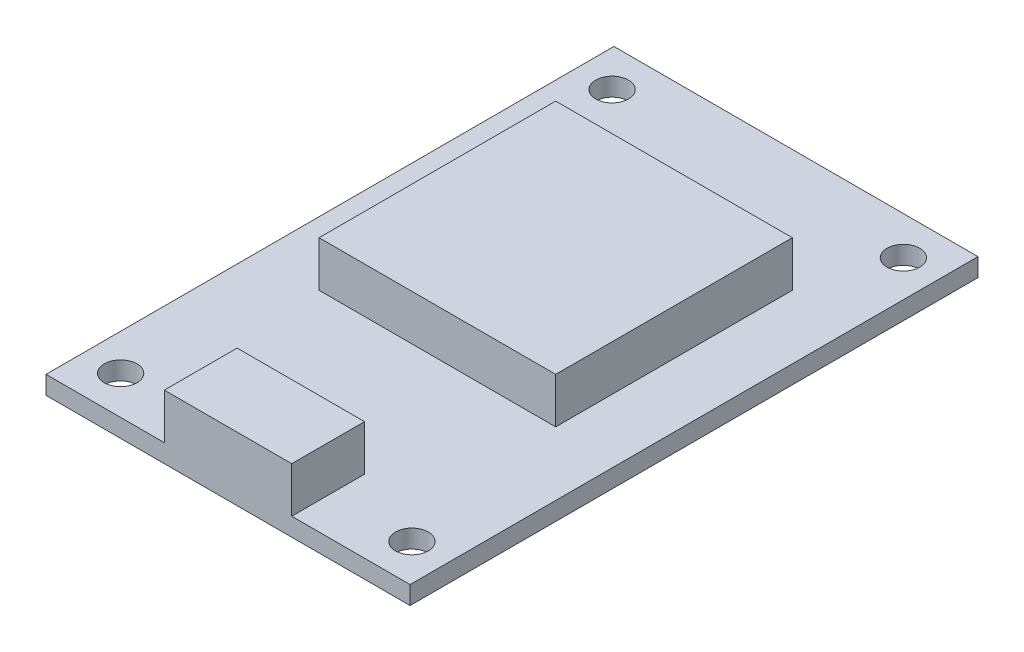
ISO-10303-21;
HEADER;
FILE_DESCRIPTION(('STEP AP214'),'2;1');
FILE_NAME('part.step','',(''),(''),'','','');
FILE_SCHEMA(('AUTOMOTIVE_DESIGN { 1 0 10303 214 1 1 1 1 }'));
ENDSEC;
DATA;
#1=APPLICATION_CONTEXT('core data for automotive mechanical design processes');
#2=APPLICATION_PROTOCOL_DEFINITION('international standard','automotive_design',2000,#1);
#3=PRODUCT_CONTEXT('',#1,'mechanical');
#4=PRODUCT('Part','Part','',(#3));
#5=PRODUCT_RELATED_PRODUCT_CATEGORY('part','',(#4));
#6=PRODUCT_DEFINITION_FORMATION('','',#4);
#7=PRODUCT_DEFINITION_CONTEXT('part definition',#1,'design');
#8=PRODUCT_DEFINITION('design','',#6,#7);
#9=PRODUCT_DEFINITION_SHAPE('','',#8);
#10=(LENGTH_UNIT() NAMED_UNIT(*) SI_UNIT(.MILLI.,.METRE.));
#11=(NAMED_UNIT(*) PLANE_ANGLE_UNIT() SI_UNIT($,.RADIAN.));
#12=(NAMED_UNIT(*) SI_UNIT($,.STERADIAN.) SOLID_ANGLE_UNIT());
#13=UNCERTAINTY_MEASURE_WITH_UNIT(LENGTH_MEASURE(1.E-05),#10,'distance_accuracy_value','');
#14=(GEOMETRIC_REPRESENTATION_CONTEXT(3) GLOBAL_UNCERTAINTY_ASSIGNED_CONTEXT((#13)) GLOBAL_UNIT_ASSIGNED_CONTEXT((#10,
#11,#12)) REPRESENTATION_CONTEXT('',''));
#15=CARTESIAN_POINT('',(0.,0.,0.));
#16=DIRECTION('',(0.,0.,1.));
#17=DIRECTION('',(1.,0.,0.));
#18=AXIS2_PLACEMENT_3D('',#15,#16,#17);
#19=CARTESIAN_POINT('',(0.,1.27,0.));
#20=DIRECTION('',(0.,-1.,0.));
#21=DIRECTION('',(0.,0.,-1.));
#22=AXIS2_PLACEMENT_3D('',#19,#20,#21);
#23=PLANE('',#22);
#24=DIRECTION('',(0.,0.,-1.));
#25=VECTOR('',#24,1.);
#26=CARTESIAN_POINT('',(8.255,1.27,5.207));
#27=LINE('',#26,#25);
#28=CARTESIAN_POINT('',(8.255,1.27,5.207));
#29=VERTEX_POINT('',#28);
#30=CARTESIAN_POINT('',(8.255,1.27,-11.303));
#31=VERTEX_POINT('',#30);
#32=EDGE_CURVE('E153',#29,#31,#27,.T.);
#33=ORIENTED_EDGE('',*,*,#32,.F.);
#34=DIRECTION('',(1.,0.,0.));
#35=VECTOR('',#34,1.);
#36=CARTESIAN_POINT('',(-8.255,1.27,5.207));
#37=LINE('',#36,#35);
#38=CARTESIAN_POINT('',(-8.255,1.27,5.207));
#39=VERTEX_POINT('',#38);
#40=EDGE_CURVE('E169',#39,#29,#37,.T.);
#41=ORIENTED_EDGE('',*,*,#40,.F.);
#42=DIRECTION('',(0.,0.,1.));
#43=VECTOR('',#42,1.);
#44=CARTESIAN_POINT('',(-8.255,1.27,5.207));
#45=LINE('',#44,#43);
#46=CARTESIAN_POINT('',(-8.255,1.27,-11.303));
#47=VERTEX_POINT('',#46);
#48=EDGE_CURVE('E182',#47,#39,#45,.T.);
#49=ORIENTED_EDGE('',*,*,#48,.F.);
#50=DIRECTION('',(-1.,0.,0.));
#51=VECTOR('',#50,1.);
#52=CARTESIAN_POINT('',(-8.255,1.27,-11.303));
#53=LINE('',#52,#51);
#54=EDGE_CURVE('E158',#31,#47,#53,.T.);
#55=ORIENTED_EDGE('',*,*,#54,.F.);
#56=EDGE_LOOP('',(#33,#41,#49,#55));
#57=FACE_BOUND('',#56,.T.);
#58=CARTESIAN_POINT('',(10.16,1.27,-17.145));
#59=DIRECTION('',(0.,1.,0.));
#60=DIRECTION('',(0.,0.,1.));
#61=AXIS2_PLACEMENT_3D('',#58,#59,#60);
#62=CIRCLE('',#61,1.143);
#63=CARTESIAN_POINT('',(10.16,1.27,-16.002));
#64=VERTEX_POINT('',#63);
#65=EDGE_CURVE('E229',#64,#64,#62,.T.);
#66=ORIENTED_EDGE('',*,*,#65,.F.);
#67=EDGE_LOOP('',(#66));
#68=FACE_BOUND('',#67,.T.);
#69=CARTESIAN_POINT('',(-10.16,1.27,-17.145));
#70=DIRECTION('',(0.,1.,0.));
#71=DIRECTION('',(0.,0.,1.));
#72=AXIS2_PLACEMENT_3D('',#69,#70,#71);
#73=CIRCLE('',#72,1.143);
#74=CARTESIAN_POINT('',(-10.16,1.27,-16.002));
#75=VERTEX_POINT('',#74);
#76=EDGE_CURVE('E221',#75,#75,#73,.T.);
#77=ORIENTED_EDGE('',*,*,#76,.F.);
#78=EDGE_LOOP('',(#77));
#79=FACE_BOUND('',#78,.T.);
#80=CARTESIAN_POINT('',(10.16,1.27,17.145));
#81=DIRECTION('',(0.,1.,0.));
#82=DIRECTION('',(0.,0.,1.));
#83=AXIS2_PLACEMENT_3D('',#80,#81,#82);
#84=CIRCLE('',#83,1.143);
#85=CARTESIAN_POINT('',(10.16,1.27,18.288));
#86=VERTEX_POINT('',#85);
#87=EDGE_CURVE('E213',#86,#86,#84,.T.);
#88=ORIENTED_EDGE('',*,*,#87,.F.);
#89=EDGE_LOOP('',(#88));
#90=FACE_BOUND('',#89,.T.);
#91=CARTESIAN_POINT('',(-10.16,1.27,17.145));
#92=DIRECTION('',(0.,1.,0.));
#93=DIRECTION('',(0.,0.,1.));
#94=AXIS2_PLACEMENT_3D('',#91,#92,#93);
#95=CIRCLE('',#94,1.143);
#96=CARTESIAN_POINT('',(-10.16,1.27,18.288));
#97=VERTEX_POINT('',#96);
#98=EDGE_CURVE('E205',#97,#97,#95,.T.);
#99=ORIENTED_EDGE('',*,*,#98,.F.);
#100=EDGE_LOOP('',(#99));
#101=FACE_BOUND('',#100,.T.);
#102=DIRECTION('',(0.,0.,-1.));
#103=VECTOR('',#102,1.);
#104=CARTESIAN_POINT('',(4.445,1.27,14.732));
#105=LINE('',#104,#103);
#106=CARTESIAN_POINT('',(4.445,1.27,19.812));
#107=VERTEX_POINT('',#106);
#108=CARTESIAN_POINT('',(4.445,1.27,14.732));
#109=VERTEX_POINT('',#108);
#110=EDGE_CURVE('E151',#107,#109,#105,.T.);
#111=ORIENTED_EDGE('',*,*,#110,.F.);
#112=DIRECTION('',(1.,0.,0.));
#113=VECTOR('',#112,1.);
#114=CARTESIAN_POINT('',(-12.7,1.27,19.812));
#115=LINE('',#114,#113);
#116=CARTESIAN_POINT('',(12.7,1.27,19.812));
#117=VERTEX_POINT('',#116);
#118=EDGE_CURVE('E248',#107,#117,#115,.T.);
#119=ORIENTED_EDGE('',*,*,#118,.T.);
#120=DIRECTION('',(0.,0.,-1.));
#121=VECTOR('',#120,1.);
#122=CARTESIAN_POINT('',(12.7,1.27,19.812));
#123=LINE('',#122,#121);
#124=CARTESIAN_POINT('',(12.7,1.27,-19.812));
#125=VERTEX_POINT('',#124);
#126=EDGE_CURVE('E237',#117,#125,#123,.T.);
#127=ORIENTED_EDGE('',*,*,#126,.T.);
#128=DIRECTION('',(-1.,0.,0.));
#129=VECTOR('',#128,1.);
#130=CARTESIAN_POINT('',(-12.7,1.27,-19.812));
#131=LINE('',#130,#129);
#132=CARTESIAN_POINT('',(-12.7,1.27,-19.812));
#133=VERTEX_POINT('',#132);
#134=EDGE_CURVE('E241',#125,#133,#131,.T.);
#135=ORIENTED_EDGE('',*,*,#134,.T.);
#136=DIRECTION('',(0.,0.,1.));
#137=VECTOR('',#136,1.);
#138=CARTESIAN_POINT('',(-12.7,1.27,19.812));
#139=LINE('',#138,#137);
#140=CARTESIAN_POINT('',(-12.7,1.27,19.812));
#141=VERTEX_POINT('',#140);
#142=EDGE_CURVE('E245',#133,#141,#139,.T.);
#143=ORIENTED_EDGE('',*,*,#142,.T.);
#144=CARTESIAN_POINT('',(-4.445,1.27,19.812));
#145=VERTEX_POINT('',#144);
#146=EDGE_CURVE('E249',#141,#145,#115,.T.);
#147=ORIENTED_EDGE('',*,*,#146,.T.);
#148=DIRECTION('',(0.,0.,1.));
#149=VECTOR('',#148,1.);
#150=CARTESIAN_POINT('',(-4.445,1.27,14.732));
#151=LINE('',#150,#149);
#152=CARTESIAN_POINT('',(-4.445,1.27,14.732));
#153=VERTEX_POINT('',#152);
#154=EDGE_CURVE('E60',#153,#145,#151,.T.);
#155=ORIENTED_EDGE('',*,*,#154,.F.);
#156=DIRECTION('',(-1.,0.,0.));
#157=VECTOR('',#156,1.);
#158=CARTESIAN_POINT('',(-4.445,1.27,14.732));
#159=LINE('',#158,#157);
#160=EDGE_CURVE('E55',#109,#153,#159,.T.);
#161=ORIENTED_EDGE('',*,*,#160,.F.);
#162=EDGE_LOOP('',(#111,#119,#127,#135,#143,#147,#155,#161));
#163=FACE_BOUND('',#162,.T.);
#164=ADVANCED_FACE('F39',(#57,#68,#79,#90,#101,#163),#23,.F.);
#165=CARTESIAN_POINT('',(0.,0.,0.));
#166=DIRECTION('',(0.,-1.,0.));
#167=DIRECTION('',(0.,0.,-1.));
#168=AXIS2_PLACEMENT_3D('',#165,#166,#167);
#169=PLANE('',#168);
#170=CARTESIAN_POINT('',(10.16,0.,17.145));
#171=DIRECTION('',(0.,1.,0.));
#172=DIRECTION('',(0.,0.,1.));
#173=AXIS2_PLACEMENT_3D('',#170,#171,#172);
#174=CIRCLE('',#173,1.143);
#175=CARTESIAN_POINT('',(10.16,0.,18.288));
#176=VERTEX_POINT('',#175);
#177=EDGE_CURVE('E209',#176,#176,#174,.T.);
#178=ORIENTED_EDGE('',*,*,#177,.T.);
#179=EDGE_LOOP('',(#178));
#180=FACE_BOUND('',#179,.T.);
#181=CARTESIAN_POINT('',(10.16,0.,-17.145));
#182=DIRECTION('',(0.,1.,0.));
#183=DIRECTION('',(0.,0.,1.));
#184=AXIS2_PLACEMENT_3D('',#181,#182,#183);
#185=CIRCLE('',#184,1.143);
#186=CARTESIAN_POINT('',(10.16,0.,-16.002));
#187=VERTEX_POINT('',#186);
#188=EDGE_CURVE('E225',#187,#187,#185,.T.);
#189=ORIENTED_EDGE('',*,*,#188,.T.);
#190=EDGE_LOOP('',(#189));
#191=FACE_BOUND('',#190,.T.);
#192=DIRECTION('',(0.,0.,-1.));
#193=VECTOR('',#192,1.);
#194=CARTESIAN_POINT('',(12.7,0.,19.812));
#195=LINE('',#194,#193);
#196=CARTESIAN_POINT('',(12.7,0.,19.812));
#197=VERTEX_POINT('',#196);
#198=CARTESIAN_POINT('',(12.7,0.,-19.812));
#199=VERTEX_POINT('',#198);
#200=EDGE_CURVE('E233',#197,#199,#195,.T.);
#201=ORIENTED_EDGE('',*,*,#200,.F.);
#202=DIRECTION('',(1.,0.,0.));
#203=VECTOR('',#202,1.);
#204=CARTESIAN_POINT('',(-12.7,0.,19.812));
#205=LINE('',#204,#203);
#206=CARTESIAN_POINT('',(-12.7,0.,19.812));
#207=VERTEX_POINT('',#206);
#208=EDGE_CURVE('E242',#207,#197,#205,.T.);
#209=ORIENTED_EDGE('',*,*,#208,.F.);
#210=DIRECTION('',(0.,0.,1.));
#211=VECTOR('',#210,1.);
#212=CARTESIAN_POINT('',(-12.7,0.,19.812));
#213=LINE('',#212,#211);
#214=CARTESIAN_POINT('',(-12.7,0.,-19.812));
#215=VERTEX_POINT('',#214);
#216=EDGE_CURVE('E259',#215,#207,#213,.T.);
#217=ORIENTED_EDGE('',*,*,#216,.F.);
#218=DIRECTION('',(-1.,0.,0.));
#219=VECTOR('',#218,1.);
#220=CARTESIAN_POINT('',(-12.7,0.,-19.812));
#221=LINE('',#220,#219);
#222=EDGE_CURVE('E256',#199,#215,#221,.T.);
#223=ORIENTED_EDGE('',*,*,#222,.F.);
#224=EDGE_LOOP('',(#201,#209,#217,#223));
#225=FACE_BOUND('',#224,.T.);
#226=CARTESIAN_POINT('',(-10.16,0.,-17.145));
#227=DIRECTION('',(0.,1.,0.));
#228=DIRECTION('',(0.,0.,1.));
#229=AXIS2_PLACEMENT_3D('',#226,#227,#228);
#230=CIRCLE('',#229,1.143);
#231=CARTESIAN_POINT('',(-10.16,0.,-16.002));
#232=VERTEX_POINT('',#231);
#233=EDGE_CURVE('E217',#232,#232,#230,.T.);
#234=ORIENTED_EDGE('',*,*,#233,.T.);
#235=EDGE_LOOP('',(#234));
#236=FACE_BOUND('',#235,.T.);
#237=CARTESIAN_POINT('',(-10.16,0.,17.145));
#238=DIRECTION('',(0.,1.,0.));
#239=DIRECTION('',(0.,0.,1.));
#240=AXIS2_PLACEMENT_3D('',#237,#238,#239);
#241=CIRCLE('',#240,1.143);
#242=CARTESIAN_POINT('',(-10.16,0.,18.288));
#243=VERTEX_POINT('',#242);
#244=EDGE_CURVE('E204',#243,#243,#241,.T.);
#245=ORIENTED_EDGE('',*,*,#244,.T.);
#246=EDGE_LOOP('',(#245));
#247=FACE_BOUND('',#246,.T.);
#248=ADVANCED_FACE('F282',(#180,#191,#225,#236,#247),#169,.T.);
#249=CARTESIAN_POINT('',(12.7,1.27,19.812));
#250=DIRECTION('',(-1.,0.,0.));
#251=DIRECTION('',(0.,0.,1.));
#252=AXIS2_PLACEMENT_3D('',#249,#250,#251);
#253=PLANE('',#252);
#254=ORIENTED_EDGE('',*,*,#200,.T.);
#255=DIRECTION('',(0.,-1.,0.));
#256=VECTOR('',#255,1.);
#257=CARTESIAN_POINT('',(12.7,1.27,-19.812));
#258=LINE('',#257,#256);
#259=EDGE_CURVE('E11',#125,#199,#258,.T.);
#260=ORIENTED_EDGE('',*,*,#259,.F.);
#261=ORIENTED_EDGE('',*,*,#126,.F.);
#262=DIRECTION('',(0.,-1.,0.));
#263=VECTOR('',#262,1.);
#264=CARTESIAN_POINT('',(12.7,1.27,19.812));
#265=LINE('',#264,#263);
#266=EDGE_CURVE('E252',#117,#197,#265,.T.);
#267=ORIENTED_EDGE('',*,*,#266,.T.);
#268=EDGE_LOOP('',(#254,#260,#261,#267));
#269=FACE_BOUND('',#268,.T.);
#270=ADVANCED_FACE('F41',(#269),#253,.F.);
#271=CARTESIAN_POINT('',(-12.7,1.27,-19.812));
#272=DIRECTION('',(0.,0.,1.));
#273=DIRECTION('',(1.,0.,0.));
#274=AXIS2_PLACEMENT_3D('',#271,#272,#273);
#275=PLANE('',#274);
#276=ORIENTED_EDGE('',*,*,#222,.T.);
#277=DIRECTION('',(0.,-1.,0.));
#278=VECTOR('',#277,1.);
#279=CARTESIAN_POINT('',(-12.7,1.27,-19.812));
#280=LINE('',#279,#278);
#281=EDGE_CURVE('E48',#133,#215,#280,.T.);
#282=ORIENTED_EDGE('',*,*,#281,.F.);
#283=ORIENTED_EDGE('',*,*,#134,.F.);
#284=ORIENTED_EDGE('',*,*,#259,.T.);
#285=EDGE_LOOP('',(#276,#282,#283,#284));
#286=FACE_BOUND('',#285,.T.);
#287=ADVANCED_FACE('F334',(#286),#275,.F.);
#288=CARTESIAN_POINT('',(-12.7,1.27,19.812));
#289=DIRECTION('',(1.,0.,0.));
#290=DIRECTION('',(0.,0.,-1.));
#291=AXIS2_PLACEMENT_3D('',#288,#289,#290);
#292=PLANE('',#291);
#293=ORIENTED_EDGE('',*,*,#216,.T.);
#294=DIRECTION('',(0.,-1.,0.));
#295=VECTOR('',#294,1.);
#296=CARTESIAN_POINT('',(-12.7,1.27,19.812));
#297=LINE('',#296,#295);
#298=EDGE_CURVE('E267',#141,#207,#297,.T.);
#299=ORIENTED_EDGE('',*,*,#298,.F.);
#300=ORIENTED_EDGE('',*,*,#142,.F.);
#301=ORIENTED_EDGE('',*,*,#281,.T.);
#302=EDGE_LOOP('',(#293,#299,#300,#301));
#303=FACE_BOUND('',#302,.T.);
#304=ADVANCED_FACE('F276',(#303),#292,.F.);
#305=CARTESIAN_POINT('',(-12.7,1.27,19.812));
#306=DIRECTION('',(0.,0.,-1.));
#307=DIRECTION('',(-1.,0.,0.));
#308=AXIS2_PLACEMENT_3D('',#305,#306,#307);
#309=PLANE('',#308);
#310=ORIENTED_EDGE('',*,*,#208,.T.);
#311=ORIENTED_EDGE('',*,*,#266,.F.);
#312=ORIENTED_EDGE('',*,*,#118,.F.);
#313=DIRECTION('',(0.,-1.,0.));
#314=VECTOR('',#313,1.);
#315=CARTESIAN_POINT('',(4.445,4.445,19.812));
#316=LINE('',#315,#314);
#317=CARTESIAN_POINT('',(4.445,4.445,19.812));
#318=VERTEX_POINT('',#317);
#319=EDGE_CURVE('E292',#318,#107,#316,.T.);
#320=ORIENTED_EDGE('',*,*,#319,.F.);
#321=DIRECTION('',(1.,0.,0.));
#322=VECTOR('',#321,1.);
#323=CARTESIAN_POINT('',(-4.445,4.445,19.812));
#324=LINE('',#323,#322);
#325=CARTESIAN_POINT('',(-4.445,4.445,19.812));
#326=VERTEX_POINT('',#325);
#327=EDGE_CURVE('E144',#326,#318,#324,.T.);
#328=ORIENTED_EDGE('',*,*,#327,.F.);
#329=DIRECTION('',(0.,-1.,0.));
#330=VECTOR('',#329,1.);
#331=CARTESIAN_POINT('',(-4.445,4.445,19.812));
#332=LINE('',#331,#330);
#333=EDGE_CURVE('E160',#326,#145,#332,.T.);
#334=ORIENTED_EDGE('',*,*,#333,.T.);
#335=ORIENTED_EDGE('',*,*,#146,.F.);
#336=ORIENTED_EDGE('',*,*,#298,.T.);
#337=EDGE_LOOP('',(#310,#311,#312,#320,#328,#334,#335,#336));
#338=FACE_BOUND('',#337,.T.);
#339=ADVANCED_FACE('F286',(#338),#309,.F.);
#340=CARTESIAN_POINT('',(10.16,1.27,-17.145));
#341=DIRECTION('',(0.,-1.,0.));
#342=DIRECTION('',(0.,0.,-1.));
#343=AXIS2_PLACEMENT_3D('',#340,#341,#342);
#344=CYLINDRICAL_SURFACE('',#343,1.143);
#345=ORIENTED_EDGE('',*,*,#65,.T.);
#346=EDGE_LOOP('',(#345));
#347=FACE_BOUND('',#346,.T.);
#348=ORIENTED_EDGE('',*,*,#188,.F.);
#349=EDGE_LOOP('',(#348));
#350=FACE_BOUND('',#349,.T.);
#351=ADVANCED_FACE('F328',(#347,#350),#344,.F.);
#352=CARTESIAN_POINT('',(-10.16,1.27,-17.145));
#353=DIRECTION('',(0.,-1.,0.));
#354=DIRECTION('',(0.,0.,-1.));
#355=AXIS2_PLACEMENT_3D('',#352,#353,#354);
#356=CYLINDRICAL_SURFACE('',#355,1.143);
#357=ORIENTED_EDGE('',*,*,#76,.T.);
#358=EDGE_LOOP('',(#357));
#359=FACE_BOUND('',#358,.T.);
#360=ORIENTED_EDGE('',*,*,#233,.F.);
#361=EDGE_LOOP('',(#360));
#362=FACE_BOUND('',#361,.T.);
#363=ADVANCED_FACE('F375',(#359,#362),#356,.F.);
#364=CARTESIAN_POINT('',(10.16,1.27,17.145));
#365=DIRECTION('',(0.,-1.,0.));
#366=DIRECTION('',(0.,0.,-1.));
#367=AXIS2_PLACEMENT_3D('',#364,#365,#366);
#368=CYLINDRICAL_SURFACE('',#367,1.143);
#369=ORIENTED_EDGE('',*,*,#87,.T.);
#370=EDGE_LOOP('',(#369));
#371=FACE_BOUND('',#370,.T.);
#372=ORIENTED_EDGE('',*,*,#177,.F.);
#373=EDGE_LOOP('',(#372));
#374=FACE_BOUND('',#373,.T.);
#375=ADVANCED_FACE('F383',(#371,#374),#368,.F.);
#376=CARTESIAN_POINT('',(-10.16,1.27,17.145));
#377=DIRECTION('',(0.,-1.,0.));
#378=DIRECTION('',(0.,0.,-1.));
#379=AXIS2_PLACEMENT_3D('',#376,#377,#378);
#380=CYLINDRICAL_SURFACE('',#379,1.143);
#381=ORIENTED_EDGE('',*,*,#98,.T.);
#382=EDGE_LOOP('',(#381));
#383=FACE_BOUND('',#382,.T.);
#384=ORIENTED_EDGE('',*,*,#244,.F.);
#385=EDGE_LOOP('',(#384));
#386=FACE_BOUND('',#385,.T.);
#387=ADVANCED_FACE('F391',(#383,#386),#380,.F.);
#388=CARTESIAN_POINT('',(8.255,4.445,5.207));
#389=DIRECTION('',(-1.,0.,0.));
#390=DIRECTION('',(0.,0.,1.));
#391=AXIS2_PLACEMENT_3D('',#388,#389,#390);
#392=PLANE('',#391);
#393=ORIENTED_EDGE('',*,*,#32,.T.);
#394=DIRECTION('',(0.,-1.,0.));
#395=VECTOR('',#394,1.);
#396=CARTESIAN_POINT('',(8.255,4.445,-11.303));
#397=LINE('',#396,#395);
#398=CARTESIAN_POINT('',(8.255,4.445,-11.303));
#399=VERTEX_POINT('',#398);
#400=EDGE_CURVE('E200',#399,#31,#397,.T.);
#401=ORIENTED_EDGE('',*,*,#400,.F.);
#402=DIRECTION('',(0.,0.,-1.));
#403=VECTOR('',#402,1.);
#404=CARTESIAN_POINT('',(8.255,4.445,5.207));
#405=LINE('',#404,#403);
#406=CARTESIAN_POINT('',(8.255,4.445,5.207));
#407=VERTEX_POINT('',#406);
#408=EDGE_CURVE('E164',#407,#399,#405,.T.);
#409=ORIENTED_EDGE('',*,*,#408,.F.);
#410=DIRECTION('',(0.,-1.,0.));
#411=VECTOR('',#410,1.);
#412=CARTESIAN_POINT('',(8.255,4.445,5.207));
#413=LINE('',#412,#411);
#414=EDGE_CURVE('E177',#407,#29,#413,.T.);
#415=ORIENTED_EDGE('',*,*,#414,.T.);
#416=EDGE_LOOP('',(#393,#401,#409,#415));
#417=FACE_BOUND('',#416,.T.);
#418=ADVANCED_FACE('F400',(#417),#392,.F.);
#419=CARTESIAN_POINT('',(-8.255,4.445,-11.303));
#420=DIRECTION('',(0.,0.,1.));
#421=DIRECTION('',(1.,0.,0.));
#422=AXIS2_PLACEMENT_3D('',#419,#420,#421);
#423=PLANE('',#422);
#424=ORIENTED_EDGE('',*,*,#54,.T.);
#425=DIRECTION('',(0.,-1.,0.));
#426=VECTOR('',#425,1.);
#427=CARTESIAN_POINT('',(-8.255,4.445,-11.303));
#428=LINE('',#427,#426);
#429=CARTESIAN_POINT('',(-8.255,4.445,-11.303));
#430=VERTEX_POINT('',#429);
#431=EDGE_CURVE('E196',#430,#47,#428,.T.);
#432=ORIENTED_EDGE('',*,*,#431,.F.);
#433=DIRECTION('',(-1.,0.,0.));
#434=VECTOR('',#433,1.);
#435=CARTESIAN_POINT('',(-8.255,4.445,-11.303));
#436=LINE('',#435,#434);
#437=EDGE_CURVE('E168',#399,#430,#436,.T.);
#438=ORIENTED_EDGE('',*,*,#437,.F.);
#439=ORIENTED_EDGE('',*,*,#400,.T.);
#440=EDGE_LOOP('',(#424,#432,#438,#439));
#441=FACE_BOUND('',#440,.T.);
#442=ADVANCED_FACE('F409',(#441),#423,.F.);
#443=CARTESIAN_POINT('',(-8.255,4.445,5.207));
#444=DIRECTION('',(1.,0.,0.));
#445=DIRECTION('',(0.,0.,-1.));
#446=AXIS2_PLACEMENT_3D('',#443,#444,#445);
#447=PLANE('',#446);
#448=ORIENTED_EDGE('',*,*,#48,.T.);
#449=DIRECTION('',(0.,-1.,0.));
#450=VECTOR('',#449,1.);
#451=CARTESIAN_POINT('',(-8.255,4.445,5.207));
#452=LINE('',#451,#450);
#453=CARTESIAN_POINT('',(-8.255,4.445,5.207));
#454=VERTEX_POINT('',#453);
#455=EDGE_CURVE('E192',#454,#39,#452,.T.);
#456=ORIENTED_EDGE('',*,*,#455,.F.);
#457=DIRECTION('',(0.,0.,1.));
#458=VECTOR('',#457,1.);
#459=CARTESIAN_POINT('',(-8.255,4.445,5.207));
#460=LINE('',#459,#458);
#461=EDGE_CURVE('E172',#430,#454,#460,.T.);
#462=ORIENTED_EDGE('',*,*,#461,.F.);
#463=ORIENTED_EDGE('',*,*,#431,.T.);
#464=EDGE_LOOP('',(#448,#456,#462,#463));
#465=FACE_BOUND('',#464,.T.);
#466=ADVANCED_FACE('F418',(#465),#447,.F.);
#467=CARTESIAN_POINT('',(-8.255,4.445,5.207));
#468=DIRECTION('',(0.,0.,-1.));
#469=DIRECTION('',(-1.,0.,0.));
#470=AXIS2_PLACEMENT_3D('',#467,#468,#469);
#471=PLANE('',#470);
#472=ORIENTED_EDGE('',*,*,#40,.T.);
#473=ORIENTED_EDGE('',*,*,#414,.F.);
#474=DIRECTION('',(1.,0.,0.));
#475=VECTOR('',#474,1.);
#476=CARTESIAN_POINT('',(-8.255,4.445,5.207));
#477=LINE('',#476,#475);
#478=EDGE_CURVE('E175',#454,#407,#477,.T.);
#479=ORIENTED_EDGE('',*,*,#478,.F.);
#480=ORIENTED_EDGE('',*,*,#455,.T.);
#481=EDGE_LOOP('',(#472,#473,#479,#480));
#482=FACE_BOUND('',#481,.T.);
#483=ADVANCED_FACE('F427',(#482),#471,.F.);
#484=CARTESIAN_POINT('',(0.,4.445,0.));
#485=DIRECTION('',(0.,-1.,0.));
#486=DIRECTION('',(0.,0.,-1.));
#487=AXIS2_PLACEMENT_3D('',#484,#485,#486);
#488=PLANE('',#487);
#489=ORIENTED_EDGE('',*,*,#408,.T.);
#490=ORIENTED_EDGE('',*,*,#437,.T.);
#491=ORIENTED_EDGE('',*,*,#461,.T.);
#492=ORIENTED_EDGE('',*,*,#478,.T.);
#493=EDGE_LOOP('',(#489,#490,#491,#492));
#494=FACE_BOUND('',#493,.T.);
#495=ADVANCED_FACE('F436',(#494),#488,.F.);
#496=CARTESIAN_POINT('',(4.445,4.445,14.732));
#497=DIRECTION('',(-1.,0.,0.));
#498=DIRECTION('',(0.,0.,1.));
#499=AXIS2_PLACEMENT_3D('',#496,#497,#498);
#500=PLANE('',#499);
#501=ORIENTED_EDGE('',*,*,#110,.T.);
#502=DIRECTION('',(0.,-1.,0.));
#503=VECTOR('',#502,1.);
#504=CARTESIAN_POINT('',(4.445,4.445,14.732));
#505=LINE('',#504,#503);
#506=CARTESIAN_POINT('',(4.445,4.445,14.732));
#507=VERTEX_POINT('',#506);
#508=EDGE_CURVE('E131',#507,#109,#505,.T.);
#509=ORIENTED_EDGE('',*,*,#508,.F.);
#510=DIRECTION('',(0.,0.,-1.));
#511=VECTOR('',#510,1.);
#512=CARTESIAN_POINT('',(4.445,4.445,14.732));
#513=LINE('',#512,#511);
#514=EDGE_CURVE('E139',#318,#507,#513,.T.);
#515=ORIENTED_EDGE('',*,*,#514,.F.);
#516=ORIENTED_EDGE('',*,*,#319,.T.);
#517=EDGE_LOOP('',(#501,#509,#515,#516));
#518=FACE_BOUND('',#517,.T.);
#519=ADVANCED_FACE('F150',(#518),#500,.F.);
#520=CARTESIAN_POINT('',(-4.445,4.445,14.732));
#521=DIRECTION('',(0.,0.,1.));
#522=DIRECTION('',(1.,0.,0.));
#523=AXIS2_PLACEMENT_3D('',#520,#521,#522);
#524=PLANE('',#523);
#525=ORIENTED_EDGE('',*,*,#160,.T.);
#526=DIRECTION('',(0.,-1.,0.));
#527=VECTOR('',#526,1.);
#528=CARTESIAN_POINT('',(-4.445,4.445,14.732));
#529=LINE('',#528,#527);
#530=CARTESIAN_POINT('',(-4.445,4.445,14.732));
#531=VERTEX_POINT('',#530);
#532=EDGE_CURVE('E134',#531,#153,#529,.T.);
#533=ORIENTED_EDGE('',*,*,#532,.F.);
#534=DIRECTION('',(-1.,0.,0.));
#535=VECTOR('',#534,1.);
#536=CARTESIAN_POINT('',(-4.445,4.445,14.732));
#537=LINE('',#536,#535);
#538=EDGE_CURVE('E127',#507,#531,#537,.T.);
#539=ORIENTED_EDGE('',*,*,#538,.F.);
#540=ORIENTED_EDGE('',*,*,#508,.T.);
#541=EDGE_LOOP('',(#525,#533,#539,#540));
#542=FACE_BOUND('',#541,.T.);
#543=ADVANCED_FACE('F129',(#542),#524,.F.);
#544=CARTESIAN_POINT('',(-4.445,4.445,14.732));
#545=DIRECTION('',(1.,0.,0.));
#546=DIRECTION('',(0.,0.,-1.));
#547=AXIS2_PLACEMENT_3D('',#544,#545,#546);
#548=PLANE('',#547);
#549=ORIENTED_EDGE('',*,*,#154,.T.);
#550=ORIENTED_EDGE('',*,*,#333,.F.);
#551=DIRECTION('',(0.,0.,1.));
#552=VECTOR('',#551,1.);
#553=CARTESIAN_POINT('',(-4.445,4.445,14.732));
#554=LINE('',#553,#552);
#555=EDGE_CURVE('E138',#531,#326,#554,.T.);
#556=ORIENTED_EDGE('',*,*,#555,.F.);
#557=ORIENTED_EDGE('',*,*,#532,.T.);
#558=EDGE_LOOP('',(#549,#550,#556,#557));
#559=FACE_BOUND('',#558,.T.);
#560=ADVANCED_FACE('F309',(#559),#548,.F.);
#561=CARTESIAN_POINT('',(0.,4.445,0.));
#562=DIRECTION('',(0.,1.,0.));
#563=DIRECTION('',(0.,0.,1.));
#564=AXIS2_PLACEMENT_3D('',#561,#562,#563);
#565=PLANE('',#564);
#566=ORIENTED_EDGE('',*,*,#514,.T.);
#567=ORIENTED_EDGE('',*,*,#538,.T.);
#568=ORIENTED_EDGE('',*,*,#555,.T.);
#569=ORIENTED_EDGE('',*,*,#327,.T.);
#570=EDGE_LOOP('',(#566,#567,#568,#569));
#571=FACE_BOUND('',#570,.T.);
#572=ADVANCED_FACE('F142',(#571),#565,.T.);
#573=CLOSED_SHELL('',(#164,#248,#270,#287,#304,#339,#351,#363,#375,#387,#418,#442,#466,#483,
#495,#519,#543,#560,#572));
#574=MANIFOLD_SOLID_BREP('B2',#573);
#575=ADVANCED_BREP_SHAPE_REPRESENTATION('',(#18,#574),#14);
#576=SHAPE_DEFINITION_REPRESENTATION(#9,#575);
ENDSEC;
END-ISO-10303-21;
